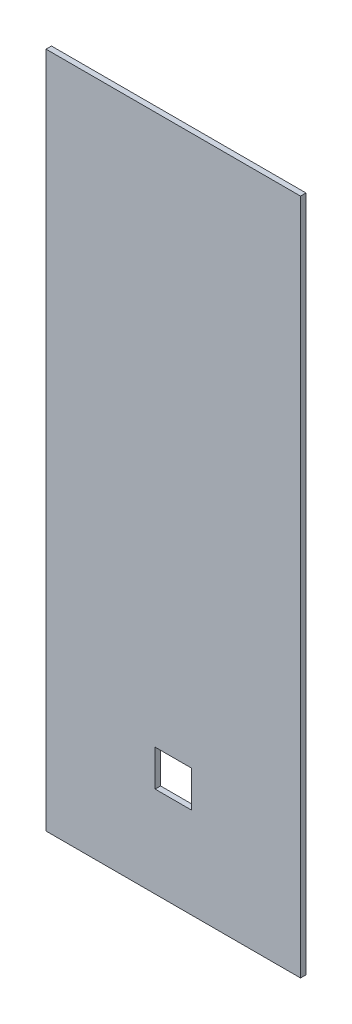
ISO-10303-21;
HEADER;
FILE_DESCRIPTION(('STEP AP214'),'2;1');
FILE_NAME('part.step','',(''),(''),'','','');
FILE_SCHEMA(('AUTOMOTIVE_DESIGN { 1 0 10303 214 1 1 1 1 }'));
ENDSEC;
DATA;
#1=APPLICATION_CONTEXT('core data for automotive mechanical design processes');
#2=APPLICATION_PROTOCOL_DEFINITION('international standard','automotive_design',2000,#1);
#3=PRODUCT_CONTEXT('',#1,'mechanical');
#4=PRODUCT('Part','Part','',(#3));
#5=PRODUCT_RELATED_PRODUCT_CATEGORY('part','',(#4));
#6=PRODUCT_DEFINITION_FORMATION('','',#4);
#7=PRODUCT_DEFINITION_CONTEXT('part definition',#1,'design');
#8=PRODUCT_DEFINITION('design','',#6,#7);
#9=PRODUCT_DEFINITION_SHAPE('','',#8);
#10=(LENGTH_UNIT() NAMED_UNIT(*) SI_UNIT(.MILLI.,.METRE.));
#11=(NAMED_UNIT(*) PLANE_ANGLE_UNIT() SI_UNIT($,.RADIAN.));
#12=(NAMED_UNIT(*) SI_UNIT($,.STERADIAN.) SOLID_ANGLE_UNIT());
#13=UNCERTAINTY_MEASURE_WITH_UNIT(LENGTH_MEASURE(1.E-05),#10,'distance_accuracy_value','');
#14=(GEOMETRIC_REPRESENTATION_CONTEXT(3) GLOBAL_UNCERTAINTY_ASSIGNED_CONTEXT((#13)) GLOBAL_UNIT_ASSIGNED_CONTEXT((#10,
#11,#12)) REPRESENTATION_CONTEXT('',''));
#15=CARTESIAN_POINT('',(0.,0.,0.));
#16=DIRECTION('',(0.,0.,1.));
#17=DIRECTION('',(1.,0.,0.));
#18=AXIS2_PLACEMENT_3D('',#15,#16,#17);
#19=CARTESIAN_POINT('',(-140.,-372.5,6.));
#20=DIRECTION('',(1.,0.,0.));
#21=DIRECTION('',(0.,0.,-1.));
#22=AXIS2_PLACEMENT_3D('',#19,#20,#21);
#23=PLANE('',#22);
#24=DIRECTION('',(0.,-1.,0.));
#25=VECTOR('',#24,1.);
#26=CARTESIAN_POINT('',(-140.,-372.5,0.));
#27=LINE('',#26,#25);
#28=CARTESIAN_POINT('',(-140.,372.5,0.));
#29=VERTEX_POINT('',#28);
#30=CARTESIAN_POINT('',(-140.,-372.5,0.));
#31=VERTEX_POINT('',#30);
#32=EDGE_CURVE('E130',#29,#31,#27,.T.);
#33=ORIENTED_EDGE('',*,*,#32,.T.);
#34=DIRECTION('',(0.,0.,-1.));
#35=VECTOR('',#34,1.);
#36=CARTESIAN_POINT('',(-140.,-372.5,6.));
#37=LINE('',#36,#35);
#38=CARTESIAN_POINT('',(-140.,-372.5,6.));
#39=VERTEX_POINT('',#38);
#40=EDGE_CURVE('E11',#39,#31,#37,.T.);
#41=ORIENTED_EDGE('',*,*,#40,.F.);
#42=DIRECTION('',(0.,-1.,0.));
#43=VECTOR('',#42,1.);
#44=CARTESIAN_POINT('',(-140.,-372.5,6.));
#45=LINE('',#44,#43);
#46=CARTESIAN_POINT('',(-140.,372.5,6.));
#47=VERTEX_POINT('',#46);
#48=EDGE_CURVE('E134',#47,#39,#45,.T.);
#49=ORIENTED_EDGE('',*,*,#48,.F.);
#50=DIRECTION('',(0.,0.,-1.));
#51=VECTOR('',#50,1.);
#52=CARTESIAN_POINT('',(-140.,372.5,6.));
#53=LINE('',#52,#51);
#54=EDGE_CURVE('E144',#47,#29,#53,.T.);
#55=ORIENTED_EDGE('',*,*,#54,.T.);
#56=EDGE_LOOP('',(#33,#41,#49,#55));
#57=FACE_BOUND('',#56,.T.);
#58=ADVANCED_FACE('F33',(#57),#23,.F.);
#59=CARTESIAN_POINT('',(140.,-372.5,6.));
#60=DIRECTION('',(0.,1.,0.));
#61=DIRECTION('',(0.,0.,1.));
#62=AXIS2_PLACEMENT_3D('',#59,#60,#61);
#63=PLANE('',#62);
#64=DIRECTION('',(1.,0.,0.));
#65=VECTOR('',#64,1.);
#66=CARTESIAN_POINT('',(140.,-372.5,0.));
#67=LINE('',#66,#65);
#68=CARTESIAN_POINT('',(140.,-372.5,0.));
#69=VERTEX_POINT('',#68);
#70=EDGE_CURVE('E147',#31,#69,#67,.T.);
#71=ORIENTED_EDGE('',*,*,#70,.T.);
#72=DIRECTION('',(0.,0.,-1.));
#73=VECTOR('',#72,1.);
#74=CARTESIAN_POINT('',(140.,-372.5,6.));
#75=LINE('',#74,#73);
#76=CARTESIAN_POINT('',(140.,-372.5,6.));
#77=VERTEX_POINT('',#76);
#78=EDGE_CURVE('E40',#77,#69,#75,.T.);
#79=ORIENTED_EDGE('',*,*,#78,.F.);
#80=DIRECTION('',(1.,0.,0.));
#81=VECTOR('',#80,1.);
#82=CARTESIAN_POINT('',(140.,-372.5,6.));
#83=LINE('',#82,#81);
#84=EDGE_CURVE('E137',#39,#77,#83,.T.);
#85=ORIENTED_EDGE('',*,*,#84,.F.);
#86=ORIENTED_EDGE('',*,*,#40,.T.);
#87=EDGE_LOOP('',(#71,#79,#85,#86));
#88=FACE_BOUND('',#87,.T.);
#89=ADVANCED_FACE('F175',(#88),#63,.F.);
#90=CARTESIAN_POINT('',(140.,-372.5,6.));
#91=DIRECTION('',(-1.,0.,0.));
#92=DIRECTION('',(0.,0.,1.));
#93=AXIS2_PLACEMENT_3D('',#90,#91,#92);
#94=PLANE('',#93);
#95=DIRECTION('',(0.,1.,0.));
#96=VECTOR('',#95,1.);
#97=CARTESIAN_POINT('',(140.,-372.5,0.));
#98=LINE('',#97,#96);
#99=CARTESIAN_POINT('',(140.,372.5,0.));
#100=VERTEX_POINT('',#99);
#101=EDGE_CURVE('E149',#69,#100,#98,.T.);
#102=ORIENTED_EDGE('',*,*,#101,.T.);
#103=DIRECTION('',(0.,0.,-1.));
#104=VECTOR('',#103,1.);
#105=CARTESIAN_POINT('',(140.,372.5,6.));
#106=LINE('',#105,#104);
#107=CARTESIAN_POINT('',(140.,372.5,6.));
#108=VERTEX_POINT('',#107);
#109=EDGE_CURVE('E154',#108,#100,#106,.T.);
#110=ORIENTED_EDGE('',*,*,#109,.F.);
#111=DIRECTION('',(0.,1.,0.));
#112=VECTOR('',#111,1.);
#113=CARTESIAN_POINT('',(140.,-372.5,6.));
#114=LINE('',#113,#112);
#115=EDGE_CURVE('E140',#77,#108,#114,.T.);
#116=ORIENTED_EDGE('',*,*,#115,.F.);
#117=ORIENTED_EDGE('',*,*,#78,.T.);
#118=EDGE_LOOP('',(#102,#110,#116,#117));
#119=FACE_BOUND('',#118,.T.);
#120=ADVANCED_FACE('F161',(#119),#94,.F.);
#121=CARTESIAN_POINT('',(140.,372.5,6.));
#122=DIRECTION('',(0.,-1.,0.));
#123=DIRECTION('',(0.,0.,-1.));
#124=AXIS2_PLACEMENT_3D('',#121,#122,#123);
#125=PLANE('',#124);
#126=DIRECTION('',(-1.,0.,0.));
#127=VECTOR('',#126,1.);
#128=CARTESIAN_POINT('',(140.,372.5,0.));
#129=LINE('',#128,#127);
#130=EDGE_CURVE('E138',#100,#29,#129,.T.);
#131=ORIENTED_EDGE('',*,*,#130,.T.);
#132=ORIENTED_EDGE('',*,*,#54,.F.);
#133=DIRECTION('',(-1.,0.,0.));
#134=VECTOR('',#133,1.);
#135=CARTESIAN_POINT('',(140.,372.5,6.));
#136=LINE('',#135,#134);
#137=EDGE_CURVE('E142',#108,#47,#136,.T.);
#138=ORIENTED_EDGE('',*,*,#137,.F.);
#139=ORIENTED_EDGE('',*,*,#109,.T.);
#140=EDGE_LOOP('',(#131,#132,#138,#139));
#141=FACE_BOUND('',#140,.T.);
#142=ADVANCED_FACE('F168',(#141),#125,.F.);
#143=CARTESIAN_POINT('',(0.,0.,6.));
#144=DIRECTION('',(0.,0.,1.));
#145=DIRECTION('',(1.,0.,0.));
#146=AXIS2_PLACEMENT_3D('',#143,#144,#145);
#147=PLANE('',#146);
#148=DIRECTION('',(0.,-1.,0.));
#149=VECTOR('',#148,1.);
#150=CARTESIAN_POINT('',(-20.,-272.5,6.));
#151=LINE('',#150,#149);
#152=CARTESIAN_POINT('',(-20.,-232.5,6.));
#153=VERTEX_POINT('',#152);
#154=CARTESIAN_POINT('',(-20.,-272.5,6.));
#155=VERTEX_POINT('',#154);
#156=EDGE_CURVE('E47',#153,#155,#151,.T.);
#157=ORIENTED_EDGE('',*,*,#156,.F.);
#158=DIRECTION('',(-1.,0.,0.));
#159=VECTOR('',#158,1.);
#160=CARTESIAN_POINT('',(20.,-232.5,6.));
#161=LINE('',#160,#159);
#162=CARTESIAN_POINT('',(20.,-232.5,6.));
#163=VERTEX_POINT('',#162);
#164=EDGE_CURVE('E115',#163,#153,#161,.T.);
#165=ORIENTED_EDGE('',*,*,#164,.F.);
#166=DIRECTION('',(0.,1.,0.));
#167=VECTOR('',#166,1.);
#168=CARTESIAN_POINT('',(20.,-272.5,6.));
#169=LINE('',#168,#167);
#170=CARTESIAN_POINT('',(20.,-272.5,6.));
#171=VERTEX_POINT('',#170);
#172=EDGE_CURVE('E118',#171,#163,#169,.T.);
#173=ORIENTED_EDGE('',*,*,#172,.F.);
#174=DIRECTION('',(1.,0.,0.));
#175=VECTOR('',#174,1.);
#176=CARTESIAN_POINT('',(20.,-272.5,6.));
#177=LINE('',#176,#175);
#178=EDGE_CURVE('E124',#155,#171,#177,.T.);
#179=ORIENTED_EDGE('',*,*,#178,.F.);
#180=EDGE_LOOP('',(#157,#165,#173,#179));
#181=FACE_BOUND('',#180,.T.);
#182=ORIENTED_EDGE('',*,*,#48,.T.);
#183=ORIENTED_EDGE('',*,*,#84,.T.);
#184=ORIENTED_EDGE('',*,*,#115,.T.);
#185=ORIENTED_EDGE('',*,*,#137,.T.);
#186=EDGE_LOOP('',(#182,#183,#184,#185));
#187=FACE_BOUND('',#186,.T.);
#188=ADVANCED_FACE('F174',(#181,#187),#147,.T.);
#189=CARTESIAN_POINT('',(0.,0.,0.));
#190=DIRECTION('',(0.,0.,1.));
#191=DIRECTION('',(1.,0.,0.));
#192=AXIS2_PLACEMENT_3D('',#189,#190,#191);
#193=PLANE('',#192);
#194=DIRECTION('',(-1.,0.,0.));
#195=VECTOR('',#194,1.);
#196=CARTESIAN_POINT('',(20.,-232.5,0.));
#197=LINE('',#196,#195);
#198=CARTESIAN_POINT('',(20.,-232.5,0.));
#199=VERTEX_POINT('',#198);
#200=CARTESIAN_POINT('',(-20.,-232.5,0.));
#201=VERTEX_POINT('',#200);
#202=EDGE_CURVE('E105',#199,#201,#197,.T.);
#203=ORIENTED_EDGE('',*,*,#202,.T.);
#204=DIRECTION('',(0.,-1.,0.));
#205=VECTOR('',#204,1.);
#206=CARTESIAN_POINT('',(-20.,-272.5,0.));
#207=LINE('',#206,#205);
#208=CARTESIAN_POINT('',(-20.,-272.5,0.));
#209=VERTEX_POINT('',#208);
#210=EDGE_CURVE('E99',#201,#209,#207,.T.);
#211=ORIENTED_EDGE('',*,*,#210,.T.);
#212=DIRECTION('',(1.,0.,0.));
#213=VECTOR('',#212,1.);
#214=CARTESIAN_POINT('',(20.,-272.5,0.));
#215=LINE('',#214,#213);
#216=CARTESIAN_POINT('',(20.,-272.5,0.));
#217=VERTEX_POINT('',#216);
#218=EDGE_CURVE('E108',#209,#217,#215,.T.);
#219=ORIENTED_EDGE('',*,*,#218,.T.);
#220=DIRECTION('',(0.,1.,0.));
#221=VECTOR('',#220,1.);
#222=CARTESIAN_POINT('',(20.,-272.5,0.));
#223=LINE('',#222,#221);
#224=EDGE_CURVE('E55',#217,#199,#223,.T.);
#225=ORIENTED_EDGE('',*,*,#224,.T.);
#226=EDGE_LOOP('',(#203,#211,#219,#225));
#227=FACE_BOUND('',#226,.T.);
#228=ORIENTED_EDGE('',*,*,#32,.F.);
#229=ORIENTED_EDGE('',*,*,#130,.F.);
#230=ORIENTED_EDGE('',*,*,#101,.F.);
#231=ORIENTED_EDGE('',*,*,#70,.F.);
#232=EDGE_LOOP('',(#228,#229,#230,#231));
#233=FACE_BOUND('',#232,.T.);
#234=ADVANCED_FACE('F112',(#227,#233),#193,.F.);
#235=CARTESIAN_POINT('',(-20.,-272.5,0.));
#236=DIRECTION('',(-1.,0.,0.));
#237=DIRECTION('',(0.,0.,1.));
#238=AXIS2_PLACEMENT_3D('',#235,#236,#237);
#239=PLANE('',#238);
#240=ORIENTED_EDGE('',*,*,#156,.T.);
#241=DIRECTION('',(0.,0.,1.));
#242=VECTOR('',#241,1.);
#243=CARTESIAN_POINT('',(-20.,-272.5,0.));
#244=LINE('',#243,#242);
#245=EDGE_CURVE('E95',#209,#155,#244,.T.);
#246=ORIENTED_EDGE('',*,*,#245,.F.);
#247=ORIENTED_EDGE('',*,*,#210,.F.);
#248=DIRECTION('',(0.,0.,1.));
#249=VECTOR('',#248,1.);
#250=CARTESIAN_POINT('',(-20.,-232.5,0.));
#251=LINE('',#250,#249);
#252=EDGE_CURVE('E128',#201,#153,#251,.T.);
#253=ORIENTED_EDGE('',*,*,#252,.T.);
#254=EDGE_LOOP('',(#240,#246,#247,#253));
#255=FACE_BOUND('',#254,.T.);
#256=ADVANCED_FACE('F97',(#255),#239,.F.);
#257=CARTESIAN_POINT('',(20.,-232.5,0.));
#258=DIRECTION('',(0.,1.,0.));
#259=DIRECTION('',(0.,0.,1.));
#260=AXIS2_PLACEMENT_3D('',#257,#258,#259);
#261=PLANE('',#260);
#262=ORIENTED_EDGE('',*,*,#164,.T.);
#263=ORIENTED_EDGE('',*,*,#252,.F.);
#264=ORIENTED_EDGE('',*,*,#202,.F.);
#265=DIRECTION('',(0.,0.,1.));
#266=VECTOR('',#265,1.);
#267=CARTESIAN_POINT('',(20.,-232.5,0.));
#268=LINE('',#267,#266);
#269=EDGE_CURVE('E131',#199,#163,#268,.T.);
#270=ORIENTED_EDGE('',*,*,#269,.T.);
#271=EDGE_LOOP('',(#262,#263,#264,#270));
#272=FACE_BOUND('',#271,.T.);
#273=ADVANCED_FACE('F192',(#272),#261,.F.);
#274=CARTESIAN_POINT('',(20.,-272.5,0.));
#275=DIRECTION('',(1.,0.,0.));
#276=DIRECTION('',(0.,0.,-1.));
#277=AXIS2_PLACEMENT_3D('',#274,#275,#276);
#278=PLANE('',#277);
#279=ORIENTED_EDGE('',*,*,#172,.T.);
#280=ORIENTED_EDGE('',*,*,#269,.F.);
#281=ORIENTED_EDGE('',*,*,#224,.F.);
#282=DIRECTION('',(0.,0.,1.));
#283=VECTOR('',#282,1.);
#284=CARTESIAN_POINT('',(20.,-272.5,0.));
#285=LINE('',#284,#283);
#286=EDGE_CURVE('E104',#217,#171,#285,.T.);
#287=ORIENTED_EDGE('',*,*,#286,.T.);
#288=EDGE_LOOP('',(#279,#280,#281,#287));
#289=FACE_BOUND('',#288,.T.);
#290=ADVANCED_FACE('F195',(#289),#278,.F.);
#291=CARTESIAN_POINT('',(20.,-272.5,0.));
#292=DIRECTION('',(0.,-1.,0.));
#293=DIRECTION('',(0.,0.,-1.));
#294=AXIS2_PLACEMENT_3D('',#291,#292,#293);
#295=PLANE('',#294);
#296=ORIENTED_EDGE('',*,*,#178,.T.);
#297=ORIENTED_EDGE('',*,*,#286,.F.);
#298=ORIENTED_EDGE('',*,*,#218,.F.);
#299=ORIENTED_EDGE('',*,*,#245,.T.);
#300=EDGE_LOOP('',(#296,#297,#298,#299));
#301=FACE_BOUND('',#300,.T.);
#302=ADVANCED_FACE('F109',(#301),#295,.F.);
#303=CLOSED_SHELL('',(#58,#89,#120,#142,#188,#234,#256,#273,#290,#302));
#304=MANIFOLD_SOLID_BREP('B2',#303);
#305=ADVANCED_BREP_SHAPE_REPRESENTATION('',(#18,#304),#14);
#306=SHAPE_DEFINITION_REPRESENTATION(#9,#305);
ENDSEC;
END-ISO-10303-21;
